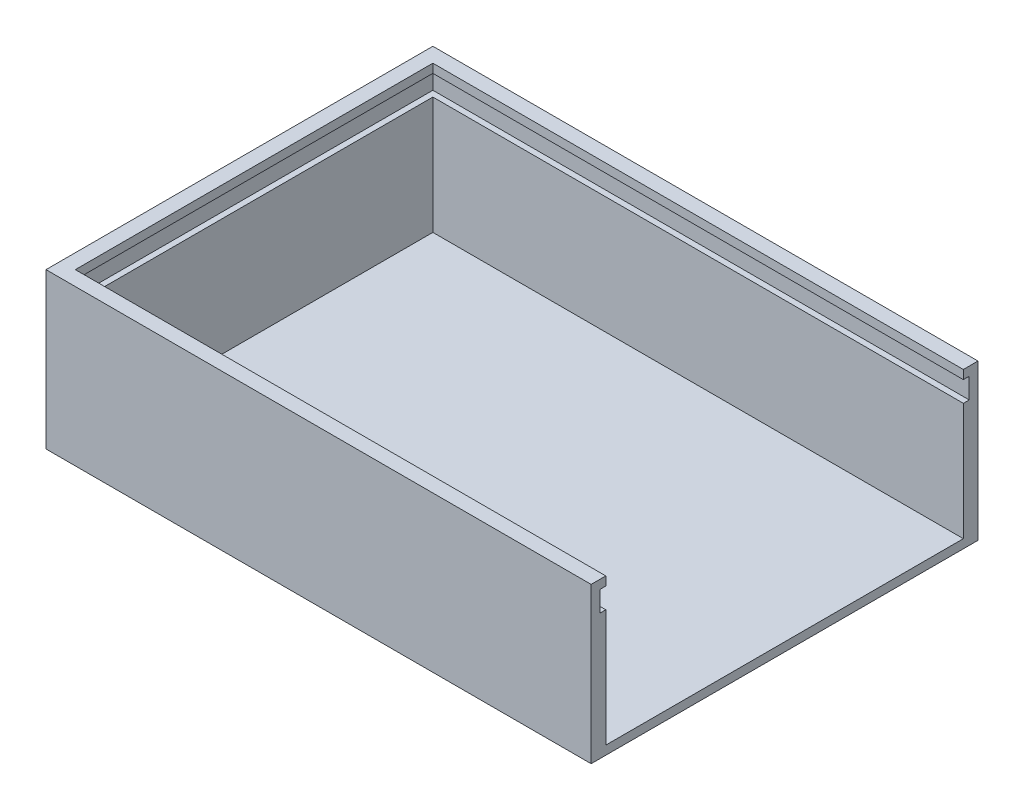
ISO-10303-21;
HEADER;
FILE_DESCRIPTION(('STEP AP214'),'2;1');
FILE_NAME('part.step','',(''),(''),'','','');
FILE_SCHEMA(('AUTOMOTIVE_DESIGN { 1 0 10303 214 1 1 1 1 }'));
ENDSEC;
DATA;
#1=APPLICATION_CONTEXT('core data for automotive mechanical design processes');
#2=APPLICATION_PROTOCOL_DEFINITION('international standard','automotive_design',2000,#1);
#3=PRODUCT_CONTEXT('',#1,'mechanical');
#4=PRODUCT('Part','Part','',(#3));
#5=PRODUCT_RELATED_PRODUCT_CATEGORY('part','',(#4));
#6=PRODUCT_DEFINITION_FORMATION('','',#4);
#7=PRODUCT_DEFINITION_CONTEXT('part definition',#1,'design');
#8=PRODUCT_DEFINITION('design','',#6,#7);
#9=PRODUCT_DEFINITION_SHAPE('','',#8);
#10=(LENGTH_UNIT() NAMED_UNIT(*) SI_UNIT(.MILLI.,.METRE.));
#11=(NAMED_UNIT(*) PLANE_ANGLE_UNIT() SI_UNIT($,.RADIAN.));
#12=(NAMED_UNIT(*) SI_UNIT($,.STERADIAN.) SOLID_ANGLE_UNIT());
#13=UNCERTAINTY_MEASURE_WITH_UNIT(LENGTH_MEASURE(1.E-05),#10,'distance_accuracy_value','');
#14=(GEOMETRIC_REPRESENTATION_CONTEXT(3) GLOBAL_UNCERTAINTY_ASSIGNED_CONTEXT((#13)) GLOBAL_UNIT_ASSIGNED_CONTEXT((#10,
#11,#12)) REPRESENTATION_CONTEXT('',''));
#15=CARTESIAN_POINT('',(0.,0.,0.));
#16=DIRECTION('',(0.,0.,1.));
#17=DIRECTION('',(1.,0.,0.));
#18=AXIS2_PLACEMENT_3D('',#15,#16,#17);
#19=CARTESIAN_POINT('',(0.,53.,-61.));
#20=DIRECTION('',(0.,0.,1.));
#21=DIRECTION('',(1.,0.,0.));
#22=AXIS2_PLACEMENT_3D('',#19,#20,#21);
#23=PLANE('',#22);
#24=DIRECTION('',(-1.,0.,0.));
#25=VECTOR('',#24,1.);
#26=CARTESIAN_POINT('',(0.,50.,-61.));
#27=LINE('',#26,#25);
#28=CARTESIAN_POINT('',(93.,50.,-61.));
#29=VERTEX_POINT('',#28);
#30=CARTESIAN_POINT('',(-88.,50.,-61.));
#31=VERTEX_POINT('',#30);
#32=EDGE_CURVE('E199',#29,#31,#27,.T.);
#33=ORIENTED_EDGE('',*,*,#32,.F.);
#34=DIRECTION('',(0.,-1.,0.));
#35=VECTOR('',#34,1.);
#36=CARTESIAN_POINT('',(93.,53.,-61.));
#37=LINE('',#36,#35);
#38=CARTESIAN_POINT('',(93.,53.,-61.));
#39=VERTEX_POINT('',#38);
#40=EDGE_CURVE('E242',#39,#29,#37,.T.);
#41=ORIENTED_EDGE('',*,*,#40,.F.);
#42=DIRECTION('',(-1.,0.,0.));
#43=VECTOR('',#42,1.);
#44=CARTESIAN_POINT('',(0.,53.,-61.));
#45=LINE('',#44,#43);
#46=CARTESIAN_POINT('',(-88.,53.,-61.));
#47=VERTEX_POINT('',#46);
#48=EDGE_CURVE('E202',#39,#47,#45,.T.);
#49=ORIENTED_EDGE('',*,*,#48,.T.);
#50=DIRECTION('',(0.,-1.,0.));
#51=VECTOR('',#50,1.);
#52=CARTESIAN_POINT('',(-88.,53.,-61.));
#53=LINE('',#52,#51);
#54=EDGE_CURVE('E230',#47,#31,#53,.T.);
#55=ORIENTED_EDGE('',*,*,#54,.T.);
#56=EDGE_LOOP('',(#33,#41,#49,#55));
#57=FACE_BOUND('',#56,.T.);
#58=ADVANCED_FACE('F35',(#57),#23,.T.);
#59=CARTESIAN_POINT('',(0.,53.,61.));
#60=DIRECTION('',(0.,0.,1.));
#61=DIRECTION('',(1.,0.,0.));
#62=AXIS2_PLACEMENT_3D('',#59,#60,#61);
#63=PLANE('',#62);
#64=DIRECTION('',(0.,-1.,0.));
#65=VECTOR('',#64,1.);
#66=CARTESIAN_POINT('',(93.,53.,61.));
#67=LINE('',#66,#65);
#68=CARTESIAN_POINT('',(93.,53.,61.));
#69=VERTEX_POINT('',#68);
#70=CARTESIAN_POINT('',(93.,50.,61.));
#71=VERTEX_POINT('',#70);
#72=EDGE_CURVE('E238',#69,#71,#67,.T.);
#73=ORIENTED_EDGE('',*,*,#72,.T.);
#74=DIRECTION('',(-1.,0.,0.));
#75=VECTOR('',#74,1.);
#76=CARTESIAN_POINT('',(0.,50.,61.));
#77=LINE('',#76,#75);
#78=CARTESIAN_POINT('',(-88.,50.,61.));
#79=VERTEX_POINT('',#78);
#80=EDGE_CURVE('E196',#71,#79,#77,.T.);
#81=ORIENTED_EDGE('',*,*,#80,.T.);
#82=DIRECTION('',(0.,-1.,0.));
#83=VECTOR('',#82,1.);
#84=CARTESIAN_POINT('',(-88.,53.,61.));
#85=LINE('',#84,#83);
#86=CARTESIAN_POINT('',(-88.,53.,61.));
#87=VERTEX_POINT('',#86);
#88=EDGE_CURVE('E234',#87,#79,#85,.T.);
#89=ORIENTED_EDGE('',*,*,#88,.F.);
#90=DIRECTION('',(-1.,0.,0.));
#91=VECTOR('',#90,1.);
#92=CARTESIAN_POINT('',(0.,53.,61.));
#93=LINE('',#92,#91);
#94=EDGE_CURVE('E220',#69,#87,#93,.T.);
#95=ORIENTED_EDGE('',*,*,#94,.F.);
#96=EDGE_LOOP('',(#73,#81,#89,#95));
#97=FACE_BOUND('',#96,.T.);
#98=ADVANCED_FACE('F300',(#97),#63,.F.);
#99=CARTESIAN_POINT('',(-88.,53.,0.));
#100=DIRECTION('',(-1.,0.,0.));
#101=DIRECTION('',(0.,0.,1.));
#102=AXIS2_PLACEMENT_3D('',#99,#100,#101);
#103=PLANE('',#102);
#104=ORIENTED_EDGE('',*,*,#88,.T.);
#105=DIRECTION('',(0.,0.,-1.));
#106=VECTOR('',#105,1.);
#107=CARTESIAN_POINT('',(-88.,50.,0.));
#108=LINE('',#107,#106);
#109=EDGE_CURVE('E11',#79,#31,#108,.T.);
#110=ORIENTED_EDGE('',*,*,#109,.T.);
#111=ORIENTED_EDGE('',*,*,#54,.F.);
#112=DIRECTION('',(0.,0.,-1.));
#113=VECTOR('',#112,1.);
#114=CARTESIAN_POINT('',(-88.,53.,0.));
#115=LINE('',#114,#113);
#116=EDGE_CURVE('E222',#87,#47,#115,.T.);
#117=ORIENTED_EDGE('',*,*,#116,.F.);
#118=EDGE_LOOP('',(#104,#110,#111,#117));
#119=FACE_BOUND('',#118,.T.);
#120=ADVANCED_FACE('F296',(#119),#103,.F.);
#121=CARTESIAN_POINT('',(0.,3.,0.));
#122=DIRECTION('',(0.,1.,0.));
#123=DIRECTION('',(0.,0.,1.));
#124=AXIS2_PLACEMENT_3D('',#121,#122,#123);
#125=PLANE('',#124);
#126=DIRECTION('',(0.,0.,-1.));
#127=VECTOR('',#126,1.);
#128=CARTESIAN_POINT('',(93.,3.,-66.));
#129=LINE('',#128,#127);
#130=CARTESIAN_POINT('',(93.,3.,61.));
#131=VERTEX_POINT('',#130);
#132=CARTESIAN_POINT('',(93.,3.,-61.));
#133=VERTEX_POINT('',#132);
#134=EDGE_CURVE('E246',#131,#133,#129,.T.);
#135=ORIENTED_EDGE('',*,*,#134,.T.);
#136=DIRECTION('',(-1.,0.,0.));
#137=VECTOR('',#136,1.);
#138=CARTESIAN_POINT('',(0.,3.,-61.));
#139=LINE('',#138,#137);
#140=CARTESIAN_POINT('',(-88.,3.,-61.));
#141=VERTEX_POINT('',#140);
#142=EDGE_CURVE('E201',#133,#141,#139,.T.);
#143=ORIENTED_EDGE('',*,*,#142,.T.);
#144=DIRECTION('',(0.,0.,-1.));
#145=VECTOR('',#144,1.);
#146=CARTESIAN_POINT('',(-88.,3.,0.));
#147=LINE('',#146,#145);
#148=CARTESIAN_POINT('',(-88.,3.,61.));
#149=VERTEX_POINT('',#148);
#150=EDGE_CURVE('E206',#149,#141,#147,.T.);
#151=ORIENTED_EDGE('',*,*,#150,.F.);
#152=DIRECTION('',(-1.,0.,0.));
#153=VECTOR('',#152,1.);
#154=CARTESIAN_POINT('',(0.,3.,61.));
#155=LINE('',#154,#153);
#156=EDGE_CURVE('E225',#131,#149,#155,.T.);
#157=ORIENTED_EDGE('',*,*,#156,.F.);
#158=EDGE_LOOP('',(#135,#143,#151,#157));
#159=FACE_BOUND('',#158,.T.);
#160=ADVANCED_FACE('F278',(#159),#125,.T.);
#161=CARTESIAN_POINT('',(93.,3.,-66.));
#162=DIRECTION('',(-1.,0.,0.));
#163=DIRECTION('',(0.,0.,1.));
#164=AXIS2_PLACEMENT_3D('',#161,#162,#163);
#165=PLANE('',#164);
#166=ORIENTED_EDGE('',*,*,#40,.T.);
#167=DIRECTION('',(0.,0.,1.));
#168=VECTOR('',#167,1.);
#169=CARTESIAN_POINT('',(93.,50.,63.));
#170=LINE('',#169,#168);
#171=CARTESIAN_POINT('',(93.,50.,-63.));
#172=VERTEX_POINT('',#171);
#173=EDGE_CURVE('E174',#172,#29,#170,.T.);
#174=ORIENTED_EDGE('',*,*,#173,.F.);
#175=DIRECTION('',(0.,1.,0.));
#176=VECTOR('',#175,1.);
#177=CARTESIAN_POINT('',(93.,50.,-63.));
#178=LINE('',#177,#176);
#179=CARTESIAN_POINT('',(93.,43.,-63.));
#180=VERTEX_POINT('',#179);
#181=EDGE_CURVE('E185',#180,#172,#178,.T.);
#182=ORIENTED_EDGE('',*,*,#181,.F.);
#183=DIRECTION('',(0.,0.,-1.));
#184=VECTOR('',#183,1.);
#185=CARTESIAN_POINT('',(93.,43.,63.));
#186=LINE('',#185,#184);
#187=CARTESIAN_POINT('',(93.,43.,-61.));
#188=VERTEX_POINT('',#187);
#189=EDGE_CURVE('E182',#188,#180,#186,.T.);
#190=ORIENTED_EDGE('',*,*,#189,.F.);
#191=EDGE_CURVE('E241',#188,#133,#37,.T.);
#192=ORIENTED_EDGE('',*,*,#191,.T.);
#193=ORIENTED_EDGE('',*,*,#134,.F.);
#194=CARTESIAN_POINT('',(93.,43.,61.));
#195=VERTEX_POINT('',#194);
#196=EDGE_CURVE('E237',#195,#131,#67,.T.);
#197=ORIENTED_EDGE('',*,*,#196,.F.);
#198=CARTESIAN_POINT('',(93.,43.,63.));
#199=VERTEX_POINT('',#198);
#200=EDGE_CURVE('E183',#199,#195,#186,.T.);
#201=ORIENTED_EDGE('',*,*,#200,.F.);
#202=DIRECTION('',(0.,-1.,0.));
#203=VECTOR('',#202,1.);
#204=CARTESIAN_POINT('',(93.,50.,63.));
#205=LINE('',#204,#203);
#206=CARTESIAN_POINT('',(93.,50.,63.));
#207=VERTEX_POINT('',#206);
#208=EDGE_CURVE('E158',#207,#199,#205,.T.);
#209=ORIENTED_EDGE('',*,*,#208,.F.);
#210=EDGE_CURVE('E176',#71,#207,#170,.T.);
#211=ORIENTED_EDGE('',*,*,#210,.F.);
#212=ORIENTED_EDGE('',*,*,#72,.F.);
#213=DIRECTION('',(0.,0.,-1.));
#214=VECTOR('',#213,1.);
#215=CARTESIAN_POINT('',(93.,53.,0.));
#216=LINE('',#215,#214);
#217=CARTESIAN_POINT('',(92.9999999999999,53.,66.));
#218=VERTEX_POINT('',#217);
#219=EDGE_CURVE('E218',#218,#69,#216,.T.);
#220=ORIENTED_EDGE('',*,*,#219,.F.);
#221=DIRECTION('',(0.,-1.,0.));
#222=VECTOR('',#221,1.);
#223=CARTESIAN_POINT('',(93.,3.,66.));
#224=LINE('',#223,#222);
#225=CARTESIAN_POINT('',(93.,0.,66.));
#226=VERTEX_POINT('',#225);
#227=EDGE_CURVE('E249',#218,#226,#224,.T.);
#228=ORIENTED_EDGE('',*,*,#227,.T.);
#229=DIRECTION('',(0.,0.,-1.));
#230=VECTOR('',#229,1.);
#231=CARTESIAN_POINT('',(93.,0.,-66.));
#232=LINE('',#231,#230);
#233=CARTESIAN_POINT('',(93.,0.,-66.));
#234=VERTEX_POINT('',#233);
#235=EDGE_CURVE('E245',#226,#234,#232,.T.);
#236=ORIENTED_EDGE('',*,*,#235,.T.);
#237=DIRECTION('',(0.,-1.,0.));
#238=VECTOR('',#237,1.);
#239=CARTESIAN_POINT('',(93.,3.,-66.));
#240=LINE('',#239,#238);
#241=CARTESIAN_POINT('',(92.9999999999999,53.,-66.));
#242=VERTEX_POINT('',#241);
#243=EDGE_CURVE('E266',#242,#234,#240,.T.);
#244=ORIENTED_EDGE('',*,*,#243,.F.);
#245=DIRECTION('',(0.,0.,-1.));
#246=VECTOR('',#245,1.);
#247=CARTESIAN_POINT('',(93.,53.,0.));
#248=LINE('',#247,#246);
#249=EDGE_CURVE('E205',#39,#242,#248,.T.);
#250=ORIENTED_EDGE('',*,*,#249,.F.);
#251=EDGE_LOOP('',(#166,#174,#182,#190,#192,#193,#197,#201,#209,#211,#212,#220,#228,#236,#244,#250));
#252=FACE_BOUND('',#251,.T.);
#253=ADVANCED_FACE('F37',(#252),#165,.F.);
#254=CARTESIAN_POINT('',(-93.,3.,-66.));
#255=DIRECTION('',(0.,0.,1.));
#256=DIRECTION('',(1.,0.,0.));
#257=AXIS2_PLACEMENT_3D('',#254,#255,#256);
#258=PLANE('',#257);
#259=DIRECTION('',(-1.,0.,0.));
#260=VECTOR('',#259,1.);
#261=CARTESIAN_POINT('',(-93.,0.,-66.));
#262=LINE('',#261,#260);
#263=CARTESIAN_POINT('',(-93.,0.,-66.));
#264=VERTEX_POINT('',#263);
#265=EDGE_CURVE('E253',#234,#264,#262,.T.);
#266=ORIENTED_EDGE('',*,*,#265,.T.);
#267=DIRECTION('',(0.,-1.,0.));
#268=VECTOR('',#267,1.);
#269=CARTESIAN_POINT('',(-93.,3.,-66.));
#270=LINE('',#269,#268);
#271=CARTESIAN_POINT('',(-93.,53.,-66.));
#272=VERTEX_POINT('',#271);
#273=EDGE_CURVE('E263',#272,#264,#270,.T.);
#274=ORIENTED_EDGE('',*,*,#273,.F.);
#275=DIRECTION('',(-1.,0.,0.));
#276=VECTOR('',#275,1.);
#277=CARTESIAN_POINT('',(0.,53.,-66.));
#278=LINE('',#277,#276);
#279=EDGE_CURVE('E209',#242,#272,#278,.T.);
#280=ORIENTED_EDGE('',*,*,#279,.F.);
#281=ORIENTED_EDGE('',*,*,#243,.T.);
#282=EDGE_LOOP('',(#266,#274,#280,#281));
#283=FACE_BOUND('',#282,.T.);
#284=ADVANCED_FACE('F317',(#283),#258,.F.);
#285=CARTESIAN_POINT('',(-93.,3.,-66.));
#286=DIRECTION('',(1.,0.,0.));
#287=DIRECTION('',(0.,0.,-1.));
#288=AXIS2_PLACEMENT_3D('',#285,#286,#287);
#289=PLANE('',#288);
#290=DIRECTION('',(0.,0.,1.));
#291=VECTOR('',#290,1.);
#292=CARTESIAN_POINT('',(-93.,0.,-66.));
#293=LINE('',#292,#291);
#294=CARTESIAN_POINT('',(-93.,0.,66.));
#295=VERTEX_POINT('',#294);
#296=EDGE_CURVE('E255',#264,#295,#293,.T.);
#297=ORIENTED_EDGE('',*,*,#296,.T.);
#298=DIRECTION('',(0.,-1.,0.));
#299=VECTOR('',#298,1.);
#300=CARTESIAN_POINT('',(-93.,3.,66.));
#301=LINE('',#300,#299);
#302=CARTESIAN_POINT('',(-93.,53.,66.));
#303=VERTEX_POINT('',#302);
#304=EDGE_CURVE('E260',#303,#295,#301,.T.);
#305=ORIENTED_EDGE('',*,*,#304,.F.);
#306=DIRECTION('',(0.,0.,1.));
#307=VECTOR('',#306,1.);
#308=CARTESIAN_POINT('',(-93.,53.,0.));
#309=LINE('',#308,#307);
#310=EDGE_CURVE('E212',#272,#303,#309,.T.);
#311=ORIENTED_EDGE('',*,*,#310,.F.);
#312=ORIENTED_EDGE('',*,*,#273,.T.);
#313=EDGE_LOOP('',(#297,#305,#311,#312));
#314=FACE_BOUND('',#313,.T.);
#315=ADVANCED_FACE('F319',(#314),#289,.F.);
#316=CARTESIAN_POINT('',(-93.,3.,66.));
#317=DIRECTION('',(0.,0.,-1.));
#318=DIRECTION('',(-1.,0.,0.));
#319=AXIS2_PLACEMENT_3D('',#316,#317,#318);
#320=PLANE('',#319);
#321=DIRECTION('',(1.,0.,0.));
#322=VECTOR('',#321,1.);
#323=CARTESIAN_POINT('',(-93.,0.,66.));
#324=LINE('',#323,#322);
#325=EDGE_CURVE('E250',#295,#226,#324,.T.);
#326=ORIENTED_EDGE('',*,*,#325,.T.);
#327=ORIENTED_EDGE('',*,*,#227,.F.);
#328=DIRECTION('',(1.,0.,0.));
#329=VECTOR('',#328,1.);
#330=CARTESIAN_POINT('',(0.,53.,66.));
#331=LINE('',#330,#329);
#332=EDGE_CURVE('E215',#303,#218,#331,.T.);
#333=ORIENTED_EDGE('',*,*,#332,.F.);
#334=ORIENTED_EDGE('',*,*,#304,.T.);
#335=EDGE_LOOP('',(#326,#327,#333,#334));
#336=FACE_BOUND('',#335,.T.);
#337=ADVANCED_FACE('F310',(#336),#320,.F.);
#338=CARTESIAN_POINT('',(0.,0.,0.));
#339=DIRECTION('',(0.,1.,0.));
#340=DIRECTION('',(0.,0.,1.));
#341=AXIS2_PLACEMENT_3D('',#338,#339,#340);
#342=PLANE('',#341);
#343=ORIENTED_EDGE('',*,*,#235,.F.);
#344=ORIENTED_EDGE('',*,*,#325,.F.);
#345=ORIENTED_EDGE('',*,*,#296,.F.);
#346=ORIENTED_EDGE('',*,*,#265,.F.);
#347=EDGE_LOOP('',(#343,#344,#345,#346));
#348=FACE_BOUND('',#347,.T.);
#349=ADVANCED_FACE('F314',(#348),#342,.F.);
#350=DIRECTION('',(1.,0.,0.));
#351=VECTOR('',#350,1.);
#352=CARTESIAN_POINT('',(0.,43.,-61.));
#353=LINE('',#352,#351);
#354=CARTESIAN_POINT('',(-88.,43.,-61.));
#355=VERTEX_POINT('',#354);
#356=EDGE_CURVE('E194',#355,#188,#353,.T.);
#357=ORIENTED_EDGE('',*,*,#356,.F.);
#358=EDGE_CURVE('E58',#355,#141,#53,.T.);
#359=ORIENTED_EDGE('',*,*,#358,.T.);
#360=ORIENTED_EDGE('',*,*,#142,.F.);
#361=ORIENTED_EDGE('',*,*,#191,.F.);
#362=EDGE_LOOP('',(#357,#359,#360,#361));
#363=FACE_BOUND('',#362,.T.);
#364=ADVANCED_FACE('F283',(#363),#23,.T.);
#365=CARTESIAN_POINT('',(-88.,43.,61.));
#366=VERTEX_POINT('',#365);
#367=EDGE_CURVE('E233',#366,#149,#85,.T.);
#368=ORIENTED_EDGE('',*,*,#367,.F.);
#369=DIRECTION('',(1.,0.,0.));
#370=VECTOR('',#369,1.);
#371=CARTESIAN_POINT('',(0.,43.,61.));
#372=LINE('',#371,#370);
#373=EDGE_CURVE('E50',#366,#195,#372,.T.);
#374=ORIENTED_EDGE('',*,*,#373,.T.);
#375=ORIENTED_EDGE('',*,*,#196,.T.);
#376=ORIENTED_EDGE('',*,*,#156,.T.);
#377=EDGE_LOOP('',(#368,#374,#375,#376));
#378=FACE_BOUND('',#377,.T.);
#379=ADVANCED_FACE('F273',(#378),#63,.F.);
#380=ORIENTED_EDGE('',*,*,#358,.F.);
#381=DIRECTION('',(0.,0.,1.));
#382=VECTOR('',#381,1.);
#383=CARTESIAN_POINT('',(-88.,43.,0.));
#384=LINE('',#383,#382);
#385=EDGE_CURVE('E43',#355,#366,#384,.T.);
#386=ORIENTED_EDGE('',*,*,#385,.T.);
#387=ORIENTED_EDGE('',*,*,#367,.T.);
#388=ORIENTED_EDGE('',*,*,#150,.T.);
#389=EDGE_LOOP('',(#380,#386,#387,#388));
#390=FACE_BOUND('',#389,.T.);
#391=ADVANCED_FACE('F270',(#390),#103,.F.);
#392=CARTESIAN_POINT('',(0.,53.,0.));
#393=DIRECTION('',(0.,1.,0.));
#394=DIRECTION('',(0.,0.,1.));
#395=AXIS2_PLACEMENT_3D('',#392,#393,#394);
#396=PLANE('',#395);
#397=ORIENTED_EDGE('',*,*,#48,.F.);
#398=ORIENTED_EDGE('',*,*,#249,.T.);
#399=ORIENTED_EDGE('',*,*,#279,.T.);
#400=ORIENTED_EDGE('',*,*,#310,.T.);
#401=ORIENTED_EDGE('',*,*,#332,.T.);
#402=ORIENTED_EDGE('',*,*,#219,.T.);
#403=ORIENTED_EDGE('',*,*,#94,.T.);
#404=ORIENTED_EDGE('',*,*,#116,.T.);
#405=EDGE_LOOP('',(#397,#398,#399,#400,#401,#402,#403,#404));
#406=FACE_BOUND('',#405,.T.);
#407=ADVANCED_FACE('F306',(#406),#396,.T.);
#408=CARTESIAN_POINT('',(-90.,50.,63.0000000000001));
#409=DIRECTION('',(0.,0.,1.));
#410=DIRECTION('',(1.,0.,0.));
#411=AXIS2_PLACEMENT_3D('',#408,#409,#410);
#412=PLANE('',#411);
#413=ORIENTED_EDGE('',*,*,#208,.T.);
#414=DIRECTION('',(1.,0.,0.));
#415=VECTOR('',#414,1.);
#416=CARTESIAN_POINT('',(-90.,43.,63.0000000000001));
#417=LINE('',#416,#415);
#418=CARTESIAN_POINT('',(-90.,43.,63.0000000000001));
#419=VERTEX_POINT('',#418);
#420=EDGE_CURVE('E150',#419,#199,#417,.T.);
#421=ORIENTED_EDGE('',*,*,#420,.F.);
#422=DIRECTION('',(0.,-1.,0.));
#423=VECTOR('',#422,1.);
#424=CARTESIAN_POINT('',(-90.,50.,63.0000000000001));
#425=LINE('',#424,#423);
#426=CARTESIAN_POINT('',(-90.,50.,63.0000000000001));
#427=VERTEX_POINT('',#426);
#428=EDGE_CURVE('E155',#427,#419,#425,.T.);
#429=ORIENTED_EDGE('',*,*,#428,.F.);
#430=DIRECTION('',(1.,0.,0.));
#431=VECTOR('',#430,1.);
#432=CARTESIAN_POINT('',(-90.,50.,63.0000000000001));
#433=LINE('',#432,#431);
#434=EDGE_CURVE('E188',#427,#207,#433,.T.);
#435=ORIENTED_EDGE('',*,*,#434,.T.);
#436=EDGE_LOOP('',(#413,#421,#429,#435));
#437=FACE_BOUND('',#436,.T.);
#438=ADVANCED_FACE('F152',(#437),#412,.F.);
#439=CARTESIAN_POINT('',(-90.,50.,63.0000000000001));
#440=DIRECTION('',(0.,1.,0.));
#441=DIRECTION('',(0.,0.,1.));
#442=AXIS2_PLACEMENT_3D('',#439,#440,#441);
#443=PLANE('',#442);
#444=ORIENTED_EDGE('',*,*,#32,.T.);
#445=ORIENTED_EDGE('',*,*,#109,.F.);
#446=ORIENTED_EDGE('',*,*,#80,.F.);
#447=ORIENTED_EDGE('',*,*,#210,.T.);
#448=ORIENTED_EDGE('',*,*,#434,.F.);
#449=DIRECTION('',(0.,0.,1.));
#450=VECTOR('',#449,1.);
#451=CARTESIAN_POINT('',(-90.,50.,63.0000000000001));
#452=LINE('',#451,#450);
#453=CARTESIAN_POINT('',(-90.,50.,-63.));
#454=VERTEX_POINT('',#453);
#455=EDGE_CURVE('E161',#454,#427,#452,.T.);
#456=ORIENTED_EDGE('',*,*,#455,.F.);
#457=DIRECTION('',(1.,0.,0.));
#458=VECTOR('',#457,1.);
#459=CARTESIAN_POINT('',(-90.,50.,-63.));
#460=LINE('',#459,#458);
#461=EDGE_CURVE('E190',#454,#172,#460,.T.);
#462=ORIENTED_EDGE('',*,*,#461,.T.);
#463=ORIENTED_EDGE('',*,*,#173,.T.);
#464=EDGE_LOOP('',(#444,#445,#446,#447,#448,#456,#462,#463));
#465=FACE_BOUND('',#464,.T.);
#466=ADVANCED_FACE('F290',(#465),#443,.F.);
#467=CARTESIAN_POINT('',(-90.,50.,-63.));
#468=DIRECTION('',(0.,0.,-1.));
#469=DIRECTION('',(-1.,0.,0.));
#470=AXIS2_PLACEMENT_3D('',#467,#468,#469);
#471=PLANE('',#470);
#472=ORIENTED_EDGE('',*,*,#181,.T.);
#473=ORIENTED_EDGE('',*,*,#461,.F.);
#474=DIRECTION('',(0.,1.,0.));
#475=VECTOR('',#474,1.);
#476=CARTESIAN_POINT('',(-90.,50.,-63.));
#477=LINE('',#476,#475);
#478=CARTESIAN_POINT('',(-90.,43.,-63.));
#479=VERTEX_POINT('',#478);
#480=EDGE_CURVE('E170',#479,#454,#477,.T.);
#481=ORIENTED_EDGE('',*,*,#480,.F.);
#482=DIRECTION('',(1.,0.,0.));
#483=VECTOR('',#482,1.);
#484=CARTESIAN_POINT('',(-90.,43.,-63.));
#485=LINE('',#484,#483);
#486=EDGE_CURVE('E160',#479,#180,#485,.T.);
#487=ORIENTED_EDGE('',*,*,#486,.T.);
#488=EDGE_LOOP('',(#472,#473,#481,#487));
#489=FACE_BOUND('',#488,.T.);
#490=ADVANCED_FACE('F285',(#489),#471,.F.);
#491=CARTESIAN_POINT('',(-90.,43.,63.0000000000001));
#492=DIRECTION('',(0.,-1.,0.));
#493=DIRECTION('',(0.,0.,-1.));
#494=AXIS2_PLACEMENT_3D('',#491,#492,#493);
#495=PLANE('',#494);
#496=ORIENTED_EDGE('',*,*,#356,.T.);
#497=ORIENTED_EDGE('',*,*,#189,.T.);
#498=ORIENTED_EDGE('',*,*,#486,.F.);
#499=DIRECTION('',(0.,0.,-1.));
#500=VECTOR('',#499,1.);
#501=CARTESIAN_POINT('',(-90.,43.,63.0000000000001));
#502=LINE('',#501,#500);
#503=EDGE_CURVE('E164',#419,#479,#502,.T.);
#504=ORIENTED_EDGE('',*,*,#503,.F.);
#505=ORIENTED_EDGE('',*,*,#420,.T.);
#506=ORIENTED_EDGE('',*,*,#200,.T.);
#507=ORIENTED_EDGE('',*,*,#373,.F.);
#508=ORIENTED_EDGE('',*,*,#385,.F.);
#509=EDGE_LOOP('',(#496,#497,#498,#504,#505,#506,#507,#508));
#510=FACE_BOUND('',#509,.T.);
#511=ADVANCED_FACE('F165',(#510),#495,.F.);
#512=CARTESIAN_POINT('',(-90.,0.,0.));
#513=DIRECTION('',(1.,0.,0.));
#514=DIRECTION('',(0.,0.,-1.));
#515=AXIS2_PLACEMENT_3D('',#512,#513,#514);
#516=PLANE('',#515);
#517=ORIENTED_EDGE('',*,*,#428,.T.);
#518=ORIENTED_EDGE('',*,*,#503,.T.);
#519=ORIENTED_EDGE('',*,*,#480,.T.);
#520=ORIENTED_EDGE('',*,*,#455,.T.);
#521=EDGE_LOOP('',(#517,#518,#519,#520));
#522=FACE_BOUND('',#521,.T.);
#523=ADVANCED_FACE('F172',(#522),#516,.T.);
#524=CLOSED_SHELL('',(#58,#98,#120,#160,#253,#284,#315,#337,#349,#364,#379,#391,#407,#438,#466,
#490,#511,#523));
#525=MANIFOLD_SOLID_BREP('B2',#524);
#526=ADVANCED_BREP_SHAPE_REPRESENTATION('',(#18,#525),#14);
#527=SHAPE_DEFINITION_REPRESENTATION(#9,#526);
ENDSEC;
END-ISO-10303-21;
